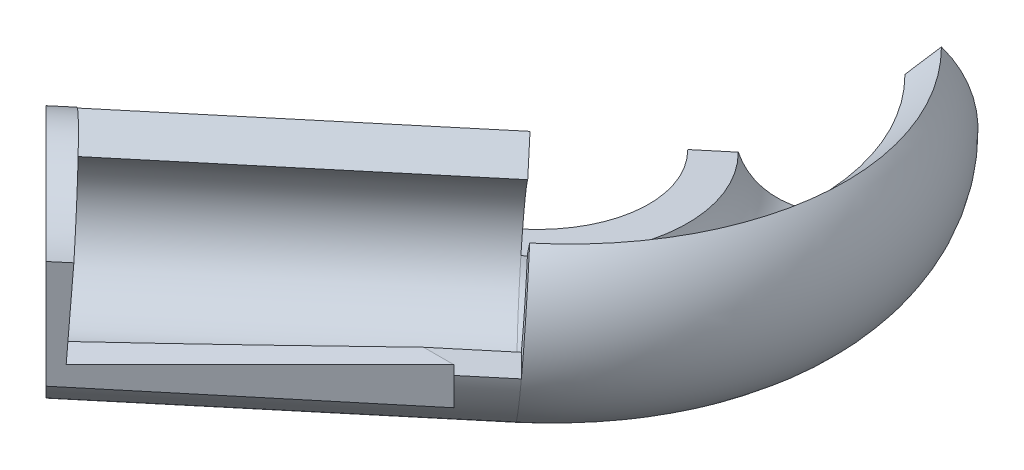
ISO-10303-21;
HEADER;
FILE_DESCRIPTION(('STEP AP214'),'2;1');
FILE_NAME('part.step','',(''),(''),'','','');
FILE_SCHEMA(('AUTOMOTIVE_DESIGN { 1 0 10303 214 1 1 1 1 }'));
ENDSEC;
DATA;
#1=APPLICATION_CONTEXT('core data for automotive mechanical design processes');
#2=APPLICATION_PROTOCOL_DEFINITION('international standard','automotive_design',2000,#1);
#3=PRODUCT_CONTEXT('',#1,'mechanical');
#4=PRODUCT('Part','Part','',(#3));
#5=PRODUCT_RELATED_PRODUCT_CATEGORY('part','',(#4));
#6=PRODUCT_DEFINITION_FORMATION('','',#4);
#7=PRODUCT_DEFINITION_CONTEXT('part definition',#1,'design');
#8=PRODUCT_DEFINITION('design','',#6,#7);
#9=PRODUCT_DEFINITION_SHAPE('','',#8);
#10=(LENGTH_UNIT() NAMED_UNIT(*) SI_UNIT(.MILLI.,.METRE.));
#11=(NAMED_UNIT(*) PLANE_ANGLE_UNIT() SI_UNIT($,.RADIAN.));
#12=(NAMED_UNIT(*) SI_UNIT($,.STERADIAN.) SOLID_ANGLE_UNIT());
#13=UNCERTAINTY_MEASURE_WITH_UNIT(LENGTH_MEASURE(1.E-05),#10,'distance_accuracy_value','');
#14=(GEOMETRIC_REPRESENTATION_CONTEXT(3) GLOBAL_UNCERTAINTY_ASSIGNED_CONTEXT((#13)) GLOBAL_UNIT_ASSIGNED_CONTEXT((#10,
#11,#12)) REPRESENTATION_CONTEXT('',''));
#15=CARTESIAN_POINT('',(0.,0.,0.));
#16=DIRECTION('',(0.,0.,1.));
#17=DIRECTION('',(1.,0.,0.));
#18=AXIS2_PLACEMENT_3D('',#15,#16,#17);
#19=CARTESIAN_POINT('',(82.4990350835088,-9.96194698091746,0.871557427476383));
#20=DIRECTION('',(0.,0.996194698091749,-0.0871557427476167));
#21=DIRECTION('',(0.,0.0871557427476167,0.996194698091749));
#22=AXIS2_PLACEMENT_3D('',#19,#20,#21);
#23=PLANE('',#22);
#24=CARTESIAN_POINT('',(-95.4929658551369,-9.96194698091505,0.871557427477423));
#25=DIRECTION('',(0.,0.996194698091749,-0.0871557427476167));
#26=DIRECTION('',(0.,0.0871557427476167,0.996194698091749));
#27=AXIS2_PLACEMENT_3D('',#24,#25,#26);
#28=CIRCLE('',#27,51.6181439181758);
#29=CARTESIAN_POINT('',(-58.9934262583318,-13.1430914644229,-35.4890904016509));
#30=VERTEX_POINT('',#29);
#31=CARTESIAN_POINT('',(-58.9934262583317,-6.78080249740961,37.2322052566039));
#32=VERTEX_POINT('',#31);
#33=EDGE_CURVE('E241',#30,#32,#28,.F.);
#34=ORIENTED_EDGE('',*,*,#33,.T.);
#35=DIRECTION('',(0.707106781186548,0.0616284167161875,0.704416026402761));
#36=VECTOR('',#35,1.);
#37=CARTESIAN_POINT('',(-6.49696538581424,-2.20543445844605,89.5289012463869));
#38=LINE('',#37,#36);
#39=CARTESIAN_POINT('',(-47.9692421433535,-5.81998154268654,48.2144390227328));
#40=VERTEX_POINT('',#39);
#41=EDGE_CURVE('E223',#32,#40,#38,.T.);
#42=ORIENTED_EDGE('',*,*,#41,.T.);
#43=CARTESIAN_POINT('',(-95.4929658551369,-9.96194698091911,0.871557427477778));
#44=DIRECTION('',(0.,0.996194698091749,-0.0871557427476167));
#45=DIRECTION('',(0.,0.0871557427476167,0.996194698091749));
#46=AXIS2_PLACEMENT_3D('',#43,#44,#45);
#47=CIRCLE('',#46,67.208694607676);
#48=CARTESIAN_POINT('',(-47.9692421433542,-14.1039124191523,-46.4713241677788));
#49=VERTEX_POINT('',#48);
#50=EDGE_CURVE('E254',#49,#40,#47,.F.);
#51=ORIENTED_EDGE('',*,*,#50,.F.);
#52=DIRECTION('',(-0.707106781186545,0.0616284167161891,0.704416026402764));
#53=VECTOR('',#52,1.);
#54=CARTESIAN_POINT('',(-27.9692421433542,-15.8470272741048,-66.395218129614));
#55=LINE('',#54,#53);
#56=EDGE_CURVE('E259',#49,#30,#55,.T.);
#57=ORIENTED_EDGE('',*,*,#56,.T.);
#58=EDGE_LOOP('',(#34,#42,#51,#57));
#59=FACE_BOUND('',#58,.T.);
#60=ADVANCED_FACE('F84',(#59),#23,.T.);
#61=CARTESIAN_POINT('',(-126.964191509471,14.5130586334584,165.885019253476));
#62=DIRECTION('',(-0.707106781186547,0.061628416716221,0.704416026402759));
#63=DIRECTION('',(0.705757556807952,0.,0.708453436019948));
#64=AXIS2_PLACEMENT_3D('',#61,#62,#63);
#65=PLANE('',#64);
#66=DIRECTION('',(-0.0435779502517489,-0.998099155647229,0.043577950251749));
#67=VECTOR('',#66,1.);
#68=CARTESIAN_POINT('',(-99.8769247538118,14.517558995098,193.07536123701));
#69=LINE('',#68,#67);
#70=CARTESIAN_POINT('',(-98.8531069630311,37.9668416394682,192.051543446229));
#71=VERTEX_POINT('',#70);
#72=CARTESIAN_POINT('',(-100.531589768046,-0.476735003677543,193.730026251244));
#73=VERTEX_POINT('',#72);
#74=EDGE_CURVE('E174',#71,#73,#69,.T.);
#75=ORIENTED_EDGE('',*,*,#74,.T.);
#76=DIRECTION('',(-0.705757556807952,0.,-0.708453436019948));
#77=VECTOR('',#76,1.);
#78=CARTESIAN_POINT('',(-100.504371441265,-0.476735003677542,193.757348547611));
#79=LINE('',#78,#77);
#80=CARTESIAN_POINT('',(-109.291265571211,-0.476735003677542,184.936889909578));
#81=VERTEX_POINT('',#80);
#82=EDGE_CURVE('E178',#73,#81,#79,.T.);
#83=ORIENTED_EDGE('',*,*,#82,.T.);
#84=CARTESIAN_POINT('',(-126.964191509471,14.5130586334584,165.885019253476));
#85=DIRECTION('',(-0.707106781186547,0.061628416716221,0.704416026402759));
#86=DIRECTION('',(0.705757556807952,0.,0.708453436019948));
#87=AXIS2_PLACEMENT_3D('',#84,#85,#86);
#88=CIRCLE('',#87,30.);
#89=CARTESIAN_POINT('',(-140.008808947293,36.9435920224515,150.82815610785));
#90=VERTEX_POINT('',#89);
#91=EDGE_CURVE('E229',#81,#90,#88,.F.);
#92=ORIENTED_EDGE('',*,*,#91,.T.);
#93=DIRECTION('',(-0.434820581260745,0.747684446299769,-0.501895438187553));
#94=VECTOR('',#93,1.);
#95=CARTESIAN_POINT('',(-126.964191509471,14.5130586334584,165.885019253476));
#96=LINE('',#95,#94);
#97=CARTESIAN_POINT('',(-146.531117666204,48.1588587169481,143.299724535036));
#98=VERTEX_POINT('',#97);
#99=EDGE_CURVE('E245',#90,#98,#96,.T.);
#100=ORIENTED_EDGE('',*,*,#99,.T.);
#101=CARTESIAN_POINT('',(-126.964191509471,14.5130586334584,165.885019253476));
#102=DIRECTION('',(-0.707106781186547,0.061628416716221,0.704416026402759));
#103=DIRECTION('',(0.705757556807952,0.,0.708453436019948));
#104=AXIS2_PLACEMENT_3D('',#101,#102,#103);
#105=CIRCLE('',#104,45.);
#106=EDGE_CURVE('E105',#71,#98,#105,.T.);
#107=ORIENTED_EDGE('',*,*,#106,.F.);
#108=EDGE_LOOP('',(#75,#83,#92,#100,#107));
#109=FACE_BOUND('',#108,.T.);
#110=ADVANCED_FACE('F176',(#109),#65,.F.);
#111=CARTESIAN_POINT('',(-153.812500105552,3.44369570965431,154.098754532861));
#112=DIRECTION('',(1.19106113860568E-13,0.996194698091756,-0.0871557427475417));
#113=DIRECTION('',(0.,0.0871557427475417,0.996194698091756));
#114=AXIS2_PLACEMENT_3D('',#111,#112,#113);
#115=PLANE('',#114);
#116=DIRECTION('',(-1.,0.,-1.36658939624408E-12));
#117=VECTOR('',#116,1.);
#118=CARTESIAN_POINT('',(-153.812500105491,-0.476735003677542,109.288026430066));
#119=LINE('',#118,#117);
#120=CARTESIAN_POINT('',(-16.0895899470558,-0.476735003677542,109.288026430254));
#121=VERTEX_POINT('',#120);
#122=CARTESIAN_POINT('',(-29.2761207329492,-0.476735003677543,109.288026430236));
#123=VERTEX_POINT('',#122);
#124=EDGE_CURVE('E194',#121,#123,#119,.T.);
#125=ORIENTED_EDGE('',*,*,#124,.F.);
#126=DIRECTION('',(-0.705757556807957,-0.0617457854182823,-0.705757556807961));
#127=VECTOR('',#126,1.);
#128=CARTESIAN_POINT('',(-62.197722392313,-4.51067388897846,63.1798939849966));
#129=LINE('',#128,#127);
#130=CARTESIAN_POINT('',(-11.6671177876282,-0.0898188249696726,113.710498589682));
#131=VERTEX_POINT('',#130);
#132=EDGE_CURVE('E183',#131,#121,#129,.T.);
#133=ORIENTED_EDGE('',*,*,#132,.F.);
#134=DIRECTION('',(0.707106781186547,-0.0616284167162209,-0.704416026402759));
#135=VECTOR('',#134,1.);
#136=CARTESIAN_POINT('',(-103.011075206361,7.87133162937067,204.706864672942));
#137=LINE('',#136,#135);
#138=CARTESIAN_POINT('',(3.05494197162078,-1.37293087806246,99.0444607125279));
#139=VERTEX_POINT('',#138);
#140=EDGE_CURVE('E235',#131,#139,#137,.T.);
#141=ORIENTED_EDGE('',*,*,#140,.T.);
#142=DIRECTION('',(0.707106781186548,0.0616284167160531,0.704416026402773));
#143=VECTOR('',#142,1.);
#144=CARTESIAN_POINT('',(-47.7464829275697,-5.80056679777883,48.4363505724474));
#145=LINE('',#144,#143);
#146=CARTESIAN_POINT('',(-7.9692421433569,-2.33375183278768,88.0622269463997));
#147=VERTEX_POINT('',#146);
#148=EDGE_CURVE('E231',#147,#139,#145,.T.);
#149=ORIENTED_EDGE('',*,*,#148,.F.);
#150=DIRECTION('',(0.707106781186547,-0.0616284167162209,-0.704416026402759));
#151=VECTOR('',#150,1.);
#152=CARTESIAN_POINT('',(-114.035259321339,6.91051067464545,193.724630906814));
#153=LINE('',#152,#151);
#154=EDGE_CURVE('E239',#123,#147,#153,.T.);
#155=ORIENTED_EDGE('',*,*,#154,.F.);
#156=EDGE_LOOP('',(#125,#133,#141,#149,#155));
#157=FACE_BOUND('',#156,.T.);
#158=ADVANCED_FACE('F283',(#157),#115,.T.);
#159=CARTESIAN_POINT('',(-134.035259321336,15.1293428006206,172.929179517504));
#160=DIRECTION('',(0.707106781186547,-0.0616284167162209,-0.704416026402759));
#161=DIRECTION('',(-0.705757556807952,0.,-0.708453436019948));
#162=AXIS2_PLACEMENT_3D('',#159,#160,#161);
#163=CYLINDRICAL_SURFACE('',#162,30.);
#164=ORIENTED_EDGE('',*,*,#91,.F.);
#165=CARTESIAN_POINT('',(45.0244022947896,-0.476735003677543,-5.44910602658305));
#166=DIRECTION('',(0.,-1.,0.));
#167=DIRECTION('',(0.708453436019948,0.,-0.705757556807952));
#168=AXIS2_PLACEMENT_3D('',#165,#166,#167);
#169=ELLIPSE('',#168,486.788426484172,30.);
#170=EDGE_CURVE('E195',#123,#81,#169,.T.);
#171=ORIENTED_EDGE('',*,*,#170,.F.);
#172=ORIENTED_EDGE('',*,*,#154,.T.);
#173=CARTESIAN_POINT('',(-27.9692421433542,5.88508029318751,67.2667755570899));
#174=DIRECTION('',(-0.707106781186547,0.0616284167162209,0.704416026402759));
#175=DIRECTION('',(0.,-0.996194698091747,0.0871557427476392));
#176=AXIS2_PLACEMENT_3D('',#173,#174,#175);
#177=CIRCLE('',#176,30.);
#178=EDGE_CURVE('E251',#40,#147,#177,.T.);
#179=ORIENTED_EDGE('',*,*,#178,.F.);
#180=CARTESIAN_POINT('',(-27.9692421433544,5.88508029318748,67.2667755570899));
#181=DIRECTION('',(-0.707106781186547,0.061628416716221,0.704416026402759));
#182=DIRECTION('',(0.705757556807952,0.,0.708453436019948));
#183=AXIS2_PLACEMENT_3D('',#180,#181,#182);
#184=CIRCLE('',#183,30.);
#185=CARTESIAN_POINT('',(-41.0138595811767,28.3156136821805,52.2099124114633));
#186=VERTEX_POINT('',#185);
#187=EDGE_CURVE('E212',#186,#40,#184,.T.);
#188=ORIENTED_EDGE('',*,*,#187,.F.);
#189=DIRECTION('',(-0.707106781186547,0.061628416716221,0.704416026402759));
#190=VECTOR('',#189,1.);
#191=CARTESIAN_POINT('',(-41.0138595811767,28.3156136821805,52.2099124114633));
#192=LINE('',#191,#190);
#193=EDGE_CURVE('E220',#186,#90,#192,.T.);
#194=ORIENTED_EDGE('',*,*,#193,.T.);
#195=EDGE_LOOP('',(#164,#171,#172,#179,#188,#194));
#196=FACE_BOUND('',#195,.T.);
#197=ADVANCED_FACE('F287',(#196),#163,.F.);
#198=CARTESIAN_POINT('',(-27.9692421433542,5.88508029318751,67.2667755570899));
#199=DIRECTION('',(-0.707106781186547,0.0616284167162209,0.704416026402759));
#200=DIRECTION('',(0.,-0.996194698091747,0.0871557427476392));
#201=AXIS2_PLACEMENT_3D('',#198,#199,#200);
#202=PLANE('',#201);
#203=CARTESIAN_POINT('',(-12.9692421434794,28.3248972264715,80.3608435268546));
#204=VERTEX_POINT('',#203);
#205=EDGE_CURVE('E255',#147,#204,#177,.T.);
#206=ORIENTED_EDGE('',*,*,#205,.F.);
#207=ORIENTED_EDGE('',*,*,#148,.T.);
#208=CARTESIAN_POINT('',(-27.9692421433542,5.88508029318751,67.2667755570899));
#209=DIRECTION('',(-0.707106781186547,0.0616284167162209,0.704416026402759));
#210=DIRECTION('',(0.,-0.996194698091747,0.0871557427476392));
#211=AXIS2_PLACEMENT_3D('',#208,#209,#210);
#212=CIRCLE('',#211,45.);
#213=CARTESIAN_POINT('',(-5.46924214335346,39.5448056931305,86.9078775119253));
#214=VERTEX_POINT('',#213);
#215=EDGE_CURVE('E246',#139,#214,#212,.T.);
#216=ORIENTED_EDGE('',*,*,#215,.T.);
#217=DIRECTION('',(0.500000000000014,0.74799389777657,0.436468932329668));
#218=VECTOR('',#217,1.);
#219=CARTESIAN_POINT('',(-27.9692421433542,5.88508029318752,67.2667755570899));
#220=LINE('',#219,#218);
#221=EDGE_CURVE('E261',#204,#214,#220,.T.);
#222=ORIENTED_EDGE('',*,*,#221,.F.);
#223=EDGE_LOOP('',(#206,#207,#216,#222));
#224=FACE_BOUND('',#223,.T.);
#225=ADVANCED_FACE('F314',(#224),#202,.T.);
#226=CARTESIAN_POINT('',(-27.9692421433544,-5.88508029318734,-67.2667755570903));
#227=DIRECTION('',(0.70710678118655,0.0616284167162156,0.704416026402756));
#228=DIRECTION('',(0.,-0.996194698091748,0.0871557427476343));
#229=AXIS2_PLACEMENT_3D('',#226,#227,#228);
#230=PLANE('',#229);
#231=ORIENTED_EDGE('',*,*,#56,.F.);
#232=CARTESIAN_POINT('',(-27.9692421433544,-5.88508029318734,-67.2667755570903));
#233=DIRECTION('',(0.70710678118655,0.0616284167162156,0.704416026402756));
#234=DIRECTION('',(0.,-0.996194698091748,0.0871557427476343));
#235=AXIS2_PLACEMENT_3D('',#232,#233,#234);
#236=CIRCLE('',#235,30.);
#237=CARTESIAN_POINT('',(-12.9692421434816,13.9400643576923,-84.0585485298266));
#238=VERTEX_POINT('',#237);
#239=EDGE_CURVE('E256',#49,#238,#236,.T.);
#240=ORIENTED_EDGE('',*,*,#239,.T.);
#241=DIRECTION('',(0.499999999999984,0.660838155028953,-0.559725765762079));
#242=VECTOR('',#241,1.);
#243=CARTESIAN_POINT('',(-27.9692421433544,-5.88508029318734,-67.2667755570903));
#244=LINE('',#243,#242);
#245=CARTESIAN_POINT('',(-5.46924214335459,23.8526366831163,-92.4544350163845));
#246=VERTEX_POINT('',#245);
#247=EDGE_CURVE('E249',#238,#246,#244,.T.);
#248=ORIENTED_EDGE('',*,*,#247,.T.);
#249=CARTESIAN_POINT('',(-27.9692421433544,-5.88508029318734,-67.2667755570903));
#250=DIRECTION('',(0.70710678118655,0.0616284167162156,0.704416026402756));
#251=DIRECTION('',(0.,-0.996194698091748,0.0871557427476343));
#252=AXIS2_PLACEMENT_3D('',#249,#250,#251);
#253=CIRCLE('',#252,45.);
#254=EDGE_CURVE('E247',#30,#246,#253,.T.);
#255=ORIENTED_EDGE('',*,*,#254,.F.);
#256=EDGE_LOOP('',(#231,#240,#248,#255));
#257=FACE_BOUND('',#256,.T.);
#258=ADVANCED_FACE('F307',(#257),#230,.F.);
#259=CARTESIAN_POINT('',(-95.4929658551369,2.58473797920544E-12,1.24336305140638E-12));
#260=DIRECTION('',(0.,0.996194698091749,-0.0871557427476167));
#261=DIRECTION('',(1.,0.,0.));
#262=AXIS2_PLACEMENT_3D('',#259,#260,#261);
#263=TOROIDAL_SURFACE('',#262,95.4929658551364,45.);
#264=ORIENTED_EDGE('',*,*,#33,.F.);
#265=ORIENTED_EDGE('',*,*,#254,.T.);
#266=CARTESIAN_POINT('',(-95.4929658551368,31.6987211881243,-2.77327875222709));
#267=DIRECTION('',(0.,0.996194698091749,-0.0871557427476167));
#268=DIRECTION('',(0.,0.0871557427476167,0.996194698091749));
#269=AXIS2_PLACEMENT_3D('',#266,#267,#268);
#270=CIRCLE('',#269,127.312771008534);
#271=EDGE_CURVE('E250',#246,#214,#270,.F.);
#272=ORIENTED_EDGE('',*,*,#271,.T.);
#273=ORIENTED_EDGE('',*,*,#215,.F.);
#274=EDGE_CURVE('E242',#32,#139,#212,.T.);
#275=ORIENTED_EDGE('',*,*,#274,.F.);
#276=EDGE_LOOP('',(#264,#265,#272,#273,#275));
#277=FACE_BOUND('',#276,.T.);
#278=ADVANCED_FACE('F310',(#277),#263,.T.);
#279=CARTESIAN_POINT('',(-95.4929658551369,2.58473797920544E-12,1.24336305140638E-12));
#280=DIRECTION('',(0.,0.996194698091749,-0.0871557427476167));
#281=DIRECTION('',(1.,0.,0.));
#282=AXIS2_PLACEMENT_3D('',#279,#280,#281);
#283=TOROIDAL_SURFACE('',#282,95.4929658551364,30.);
#284=ORIENTED_EDGE('',*,*,#239,.F.);
#285=ORIENTED_EDGE('',*,*,#50,.T.);
#286=ORIENTED_EDGE('',*,*,#178,.T.);
#287=ORIENTED_EDGE('',*,*,#205,.T.);
#288=CARTESIAN_POINT('',(-95.4929658551368,21.1324807920813,-1.8488525014841));
#289=DIRECTION('',(0.,0.996194698091749,-0.0871557427476167));
#290=DIRECTION('',(0.,0.0871557427476167,0.996194698091749));
#291=AXIS2_PLACEMENT_3D('',#288,#289,#290);
#292=CIRCLE('',#291,116.706169290376);
#293=EDGE_CURVE('E266',#238,#204,#292,.F.);
#294=ORIENTED_EDGE('',*,*,#293,.F.);
#295=EDGE_LOOP('',(#284,#285,#286,#287,#294));
#296=FACE_BOUND('',#295,.T.);
#297=ADVANCED_FACE('F302',(#296),#283,.F.);
#298=CARTESIAN_POINT('',(-95.4929658551368,14.6454535197411,-1.28131115517111));
#299=DIRECTION('',(0.,0.996194698091749,-0.0871557427476167));
#300=DIRECTION('',(0.,0.0871557427476167,0.996194698091749));
#301=AXIS2_PLACEMENT_3D('',#298,#299,#300);
#302=CONICAL_SURFACE('',#301,110.194362627717,0.785398163397443);
#303=ORIENTED_EDGE('',*,*,#293,.T.);
#304=ORIENTED_EDGE('',*,*,#221,.T.);
#305=ORIENTED_EDGE('',*,*,#271,.F.);
#306=ORIENTED_EDGE('',*,*,#247,.F.);
#307=EDGE_LOOP('',(#303,#304,#305,#306));
#308=FACE_BOUND('',#307,.T.);
#309=ADVANCED_FACE('F317',(#308),#302,.F.);
#310=CARTESIAN_POINT('',(-134.035259321336,15.1293428006206,172.929179517504));
#311=DIRECTION('',(0.707106781186547,-0.0616284167162209,-0.704416026402759));
#312=DIRECTION('',(-0.705757556807952,0.,-0.708453436019948));
#313=AXIS2_PLACEMENT_3D('',#310,#311,#312);
#314=CYLINDRICAL_SURFACE('',#313,45.);
#315=CARTESIAN_POINT('',(-134.035259321336,15.1293428006206,172.929179517504));
#316=DIRECTION('',(-0.707106781186547,0.0616284167162209,0.704416026402759));
#317=DIRECTION('',(0.705757556807952,0.,0.708453436019948));
#318=AXIS2_PLACEMENT_3D('',#315,#316,#317);
#319=CIRCLE('',#318,45.);
#320=CARTESIAN_POINT('',(-132.074251560007,60.043804804746,170.968171756176));
#321=VERTEX_POINT('',#320);
#322=CARTESIAN_POINT('',(-134.033391988253,59.9582668863585,169.009031327929));
#323=VERTEX_POINT('',#322);
#324=EDGE_CURVE('E232',#321,#323,#319,.T.);
#325=ORIENTED_EDGE('',*,*,#324,.F.);
#326=CARTESIAN_POINT('',(-132.070513334181,14.9581039047996,170.971909982002));
#327=DIRECTION('',(0.707106781186546,0.,-0.707106781186549));
#328=DIRECTION('',(0.0218200751490108,-0.999523770923425,0.0218200751490107));
#329=AXIS2_PLACEMENT_3D('',#326,#327,#328);
#330=ELLIPSE('',#329,45.0857825071047,45.);
#331=CARTESIAN_POINT('',(-104.921993416492,38.4699939280121,198.12042989969));
#332=VERTEX_POINT('',#331);
#333=EDGE_CURVE('E204',#321,#332,#330,.T.);
#334=ORIENTED_EDGE('',*,*,#333,.T.);
#335=CARTESIAN_POINT('',(14136.7158128062,-1228.64856645762,-14043.517376323));
#336=DIRECTION('',(-0.707106781186549,0.,-0.707106781186546));
#337=DIRECTION('',(0.705762681254722,-0.0616285282664433,-0.705762681254725));
#338=AXIS2_PLACEMENT_3D('',#335,#336,#337);
#339=ELLIPSE('',#338,23651.2114333705,45.);
#340=EDGE_CURVE('E208',#332,#71,#339,.T.);
#341=ORIENTED_EDGE('',*,*,#340,.T.);
#342=ORIENTED_EDGE('',*,*,#106,.T.);
#343=DIRECTION('',(-0.707106781186547,0.061628416716221,0.704416026402759));
#344=VECTOR('',#343,1.);
#345=CARTESIAN_POINT('',(-47.5361683000879,39.5308803766771,44.6814808386501));
#346=LINE('',#345,#344);
#347=CARTESIAN_POINT('',(-47.5361683000879,39.5308803766771,44.6814808386501));
#348=VERTEX_POINT('',#347);
#349=EDGE_CURVE('E221',#348,#98,#346,.T.);
#350=ORIENTED_EDGE('',*,*,#349,.F.);
#351=CARTESIAN_POINT('',(-27.9692421433543,5.8850802931875,67.26677555709));
#352=DIRECTION('',(-0.707106781186547,0.061628416716221,0.704416026402759));
#353=DIRECTION('',(0.705757556807952,0.,0.708453436019948));
#354=AXIS2_PLACEMENT_3D('',#351,#352,#353);
#355=CIRCLE('',#354,45.);
#356=EDGE_CURVE('E217',#348,#32,#355,.T.);
#357=ORIENTED_EDGE('',*,*,#356,.T.);
#358=ORIENTED_EDGE('',*,*,#274,.T.);
#359=ORIENTED_EDGE('',*,*,#140,.F.);
#360=CARTESIAN_POINT('',(-43.0687706140386,7.20109091218945,82.3088457632711));
#361=DIRECTION('',(0.707106781186549,0.,-0.707106781186546));
#362=DIRECTION('',(0.0218200751489624,-0.999523770923427,0.0218200751489625));
#363=AXIS2_PLACEMENT_3D('',#360,#361,#362);
#364=ELLIPSE('',#363,45.0857825071047,45.);
#365=CARTESIAN_POINT('',(-16.0895899470558,-16.7078601008167,109.288026430254));
#366=VERTEX_POINT('',#365);
#367=EDGE_CURVE('E91',#131,#366,#364,.T.);
#368=ORIENTED_EDGE('',*,*,#367,.T.);
#369=CARTESIAN_POINT('',(-104.921993416492,-8.56282435910335,198.12042989969));
#370=VERTEX_POINT('',#369);
#371=EDGE_CURVE('E184',#366,#370,#339,.T.);
#372=ORIENTED_EDGE('',*,*,#371,.T.);
#373=EDGE_CURVE('E98',#370,#323,#330,.T.);
#374=ORIENTED_EDGE('',*,*,#373,.T.);
#375=EDGE_LOOP('',(#325,#334,#341,#342,#350,#357,#358,#359,#368,#372,#374));
#376=FACE_BOUND('',#375,.T.);
#377=ADVANCED_FACE('F278',(#376),#314,.T.);
#378=CARTESIAN_POINT('',(-153.812500105551,13.4056426905739,153.227197105386));
#379=DIRECTION('',(-0.707106781186547,0.0616284167162209,0.704416026402759));
#380=DIRECTION('',(0.705757556807952,0.,0.708453436019948));
#381=AXIS2_PLACEMENT_3D('',#378,#379,#380);
#382=PLANE('',#381);
#383=DIRECTION('',(-0.706770036377104,-0.0308582462077347,-0.706770036377102));
#384=VECTOR('',#383,1.);
#385=CARTESIAN_POINT('',(-152.812230049475,59.1383651098791,150.230193266708));
#386=LINE('',#385,#384);
#387=EDGE_CURVE('E205',#321,#323,#386,.T.);
#388=ORIENTED_EDGE('',*,*,#387,.F.);
#389=ORIENTED_EDGE('',*,*,#324,.T.);
#390=EDGE_LOOP('',(#388,#389));
#391=FACE_BOUND('',#390,.T.);
#392=ADVANCED_FACE('F323',(#391),#382,.T.);
#393=CARTESIAN_POINT('',(-35.4477659622052,18.7445818476551,58.6346243875772));
#394=DIRECTION('',(0.557611927878223,0.661188253838844,0.501895438187549));
#395=DIRECTION('',(-0.764442846459799,0.644691503353689,0.));
#396=AXIS2_PLACEMENT_3D('',#393,#394,#395);
#397=PLANE('',#396);
#398=ORIENTED_EDGE('',*,*,#99,.F.);
#399=ORIENTED_EDGE('',*,*,#193,.F.);
#400=DIRECTION('',(-0.434820581260745,0.747684446299769,-0.501895438187553));
#401=VECTOR('',#400,1.);
#402=CARTESIAN_POINT('',(-35.4477659622052,18.7445818476551,58.6346243875772));
#403=LINE('',#402,#401);
#404=EDGE_CURVE('E214',#186,#348,#403,.T.);
#405=ORIENTED_EDGE('',*,*,#404,.T.);
#406=ORIENTED_EDGE('',*,*,#349,.T.);
#407=EDGE_LOOP('',(#398,#399,#405,#406));
#408=FACE_BOUND('',#407,.T.);
#409=ADVANCED_FACE('F292',(#408),#397,.T.);
#410=CARTESIAN_POINT('',(-47.7464829275686,4.16138018314074,47.5647931449719));
#411=DIRECTION('',(-0.707106781186547,0.061628416716221,0.704416026402759));
#412=DIRECTION('',(0.705757556807952,0.,0.708453436019948));
#413=AXIS2_PLACEMENT_3D('',#410,#411,#412);
#414=PLANE('',#413);
#415=ORIENTED_EDGE('',*,*,#41,.F.);
#416=ORIENTED_EDGE('',*,*,#356,.F.);
#417=ORIENTED_EDGE('',*,*,#404,.F.);
#418=ORIENTED_EDGE('',*,*,#187,.T.);
#419=EDGE_LOOP('',(#415,#416,#417,#418));
#420=FACE_BOUND('',#419,.T.);
#421=ADVANCED_FACE('F296',(#420),#414,.F.);
#422=CARTESIAN_POINT('',(-113.627740954852,-50.799542607262,206.82617743805));
#423=DIRECTION('',(-0.707106781186549,0.,-0.707106781186546));
#424=DIRECTION('',(-0.707106781186546,0.,0.707106781186549));
#425=AXIS2_PLACEMENT_3D('',#422,#423,#424);
#426=PLANE('',#425);
#427=DIRECTION('',(-0.707106781186546,0.,0.707106781186549));
#428=VECTOR('',#427,1.);
#429=CARTESIAN_POINT('',(-113.627740954852,-0.476735003677543,206.82617743805));
#430=LINE('',#429,#428);
#431=EDGE_CURVE('E187',#121,#73,#430,.T.);
#432=ORIENTED_EDGE('',*,*,#431,.T.);
#433=ORIENTED_EDGE('',*,*,#74,.F.);
#434=ORIENTED_EDGE('',*,*,#340,.F.);
#435=DIRECTION('',(0.,-1.,0.));
#436=VECTOR('',#435,1.);
#437=CARTESIAN_POINT('',(-104.921993416492,-50.799542607262,198.12042989969));
#438=LINE('',#437,#436);
#439=EDGE_CURVE('E13',#332,#370,#438,.T.);
#440=ORIENTED_EDGE('',*,*,#439,.T.);
#441=ORIENTED_EDGE('',*,*,#371,.F.);
#442=DIRECTION('',(0.,1.,0.));
#443=VECTOR('',#442,1.);
#444=CARTESIAN_POINT('',(-16.0895899470558,-50.799542607262,109.288026430254));
#445=LINE('',#444,#443);
#446=EDGE_CURVE('E191',#366,#121,#445,.T.);
#447=ORIENTED_EDGE('',*,*,#446,.T.);
#448=EDGE_LOOP('',(#432,#433,#434,#440,#441,#447));
#449=FACE_BOUND('',#448,.T.);
#450=ADVANCED_FACE('F188',(#449),#426,.F.);
#451=CARTESIAN_POINT('',(-16.0895899470558,-50.799542607262,109.288026430254));
#452=DIRECTION('',(0.707106781186549,0.,-0.707106781186546));
#453=DIRECTION('',(-0.707106781186546,0.,-0.707106781186549));
#454=AXIS2_PLACEMENT_3D('',#451,#452,#453);
#455=PLANE('',#454);
#456=ORIENTED_EDGE('',*,*,#446,.F.);
#457=ORIENTED_EDGE('',*,*,#367,.F.);
#458=ORIENTED_EDGE('',*,*,#132,.T.);
#459=EDGE_LOOP('',(#456,#457,#458));
#460=FACE_BOUND('',#459,.T.);
#461=ADVANCED_FACE('F281',(#460),#455,.F.);
#462=CARTESIAN_POINT('',(-195.220943255071,-0.476735003677542,-69.8433268777609));
#463=DIRECTION('',(0.,-1.,0.));
#464=DIRECTION('',(0.,0.,-1.));
#465=AXIS2_PLACEMENT_3D('',#462,#463,#464);
#466=PLANE('',#465);
#467=ORIENTED_EDGE('',*,*,#124,.T.);
#468=ORIENTED_EDGE('',*,*,#170,.T.);
#469=ORIENTED_EDGE('',*,*,#82,.F.);
#470=ORIENTED_EDGE('',*,*,#431,.F.);
#471=EDGE_LOOP('',(#467,#468,#469,#470));
#472=FACE_BOUND('',#471,.T.);
#473=ADVANCED_FACE('F197',(#472),#466,.F.);
#474=CARTESIAN_POINT('',(-284.053346724508,60.043804804746,18.9890765916756));
#475=DIRECTION('',(0.707106781186546,0.,-0.707106781186549));
#476=DIRECTION('',(-0.707106781186549,0.,-0.707106781186546));
#477=AXIS2_PLACEMENT_3D('',#474,#475,#476);
#478=PLANE('',#477);
#479=ORIENTED_EDGE('',*,*,#387,.T.);
#480=ORIENTED_EDGE('',*,*,#373,.F.);
#481=ORIENTED_EDGE('',*,*,#439,.F.);
#482=ORIENTED_EDGE('',*,*,#333,.F.);
#483=EDGE_LOOP('',(#479,#480,#481,#482));
#484=FACE_BOUND('',#483,.T.);
#485=ADVANCED_FACE('F412',(#484),#478,.F.);
#486=CLOSED_SHELL('',(#60,#110,#158,#197,#225,#258,#278,#297,#309,#377,#392,#409,#421,#450,#461,
#473,#485));
#487=MANIFOLD_SOLID_BREP('B2',#486);
#488=ADVANCED_BREP_SHAPE_REPRESENTATION('',(#18,#487),#14);
#489=SHAPE_DEFINITION_REPRESENTATION(#9,#488);
ENDSEC;
END-ISO-10303-21;
